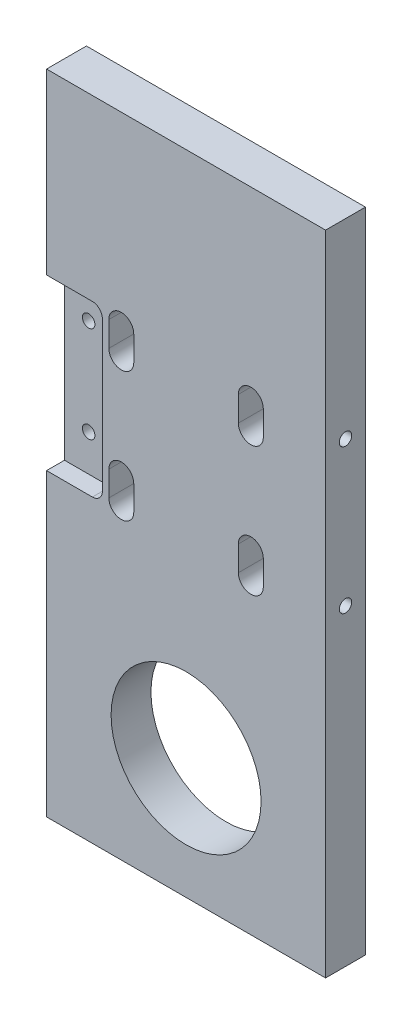
ISO-10303-21;
HEADER;
FILE_DESCRIPTION(('STEP AP214'),'2;1');
FILE_NAME('part.step','',(''),(''),'','','');
FILE_SCHEMA(('AUTOMOTIVE_DESIGN { 1 0 10303 214 1 1 1 1 }'));
ENDSEC;
DATA;
#1=APPLICATION_CONTEXT('core data for automotive mechanical design processes');
#2=APPLICATION_PROTOCOL_DEFINITION('international standard','automotive_design',2000,#1);
#3=PRODUCT_CONTEXT('',#1,'mechanical');
#4=PRODUCT('Part','Part','',(#3));
#5=PRODUCT_RELATED_PRODUCT_CATEGORY('part','',(#4));
#6=PRODUCT_DEFINITION_FORMATION('','',#4);
#7=PRODUCT_DEFINITION_CONTEXT('part definition',#1,'design');
#8=PRODUCT_DEFINITION('design','',#6,#7);
#9=PRODUCT_DEFINITION_SHAPE('','',#8);
#10=(LENGTH_UNIT() NAMED_UNIT(*) SI_UNIT(.MILLI.,.METRE.));
#11=(NAMED_UNIT(*) PLANE_ANGLE_UNIT() SI_UNIT($,.RADIAN.));
#12=(NAMED_UNIT(*) SI_UNIT($,.STERADIAN.) SOLID_ANGLE_UNIT());
#13=UNCERTAINTY_MEASURE_WITH_UNIT(LENGTH_MEASURE(1.E-05),#10,'distance_accuracy_value','');
#14=(GEOMETRIC_REPRESENTATION_CONTEXT(3) GLOBAL_UNCERTAINTY_ASSIGNED_CONTEXT((#13)) GLOBAL_UNIT_ASSIGNED_CONTEXT((#10,
#11,#12)) REPRESENTATION_CONTEXT('',''));
#15=CARTESIAN_POINT('',(0.,0.,0.));
#16=DIRECTION('',(0.,0.,1.));
#17=DIRECTION('',(1.,0.,0.));
#18=AXIS2_PLACEMENT_3D('',#15,#16,#17);
#19=CARTESIAN_POINT('',(28.,67.5,4.));
#20=DIRECTION('',(1.,0.,0.));
#21=DIRECTION('',(0.,1.,0.));
#22=AXIS2_PLACEMENT_3D('',#19,#20,#21);
#23=CYLINDRICAL_SURFACE('',#22,1.24999999999999);
#24=CARTESIAN_POINT('',(28.,67.5,4.));
#25=DIRECTION('',(1.,0.,0.));
#26=DIRECTION('',(0.,1.,0.));
#27=AXIS2_PLACEMENT_3D('',#24,#25,#26);
#28=CIRCLE('',#27,1.24999999999999);
#29=CARTESIAN_POINT('',(28.,68.75,4.));
#30=VERTEX_POINT('',#29);
#31=EDGE_CURVE('E11',#30,#30,#28,.T.);
#32=ORIENTED_EDGE('',*,*,#31,.T.);
#33=EDGE_LOOP('',(#32));
#34=FACE_BOUND('',#33,.T.);
#35=CARTESIAN_POINT('',(16.,67.5,4.));
#36=DIRECTION('',(1.,0.,0.));
#37=DIRECTION('',(0.,1.,0.));
#38=AXIS2_PLACEMENT_3D('',#35,#36,#37);
#39=CIRCLE('',#38,1.25);
#40=CARTESIAN_POINT('',(16.,68.75,4.));
#41=VERTEX_POINT('',#40);
#42=EDGE_CURVE('E26',#41,#41,#39,.T.);
#43=ORIENTED_EDGE('',*,*,#42,.F.);
#44=EDGE_LOOP('',(#43));
#45=FACE_BOUND('',#44,.T.);
#46=ADVANCED_FACE('F16',(#34,#45),#23,.F.);
#47=CARTESIAN_POINT('',(16.,67.5,4.));
#48=DIRECTION('',(1.,0.,0.));
#49=DIRECTION('',(0.,1.,0.));
#50=AXIS2_PLACEMENT_3D('',#47,#48,#49);
#51=CONICAL_SURFACE('',#50,1.25,1.02974425867666);
#52=ORIENTED_EDGE('',*,*,#42,.T.);
#53=EDGE_LOOP('',(#52));
#54=FACE_BOUND('',#53,.T.);
#55=CARTESIAN_POINT('',(15.5,67.5,4.));
#56=DIRECTION('',(1.,0.,0.));
#57=DIRECTION('',(0.,0.,1.));
#58=AXIS2_PLACEMENT_3D('',#55,#56,#57);
#59=CIRCLE('',#58,0.417860258824787);
#60=CARTESIAN_POINT('',(15.5,67.5,4.41786025882479));
#61=VERTEX_POINT('',#60);
#62=EDGE_CURVE('E266',#61,#61,#59,.T.);
#63=ORIENTED_EDGE('',*,*,#62,.F.);
#64=EDGE_LOOP('',(#63));
#65=FACE_BOUND('',#64,.T.);
#66=ADVANCED_FACE('F439',(#54,#65),#51,.F.);
#67=CARTESIAN_POINT('',(28.,38.5,4.));
#68=DIRECTION('',(1.,0.,0.));
#69=DIRECTION('',(0.,1.,0.));
#70=AXIS2_PLACEMENT_3D('',#67,#68,#69);
#71=CYLINDRICAL_SURFACE('',#70,1.24999999999999);
#72=CARTESIAN_POINT('',(28.,38.5,4.));
#73=DIRECTION('',(1.,0.,0.));
#74=DIRECTION('',(0.,1.,0.));
#75=AXIS2_PLACEMENT_3D('',#72,#73,#74);
#76=CIRCLE('',#75,1.24999999999999);
#77=CARTESIAN_POINT('',(28.,39.75,4.));
#78=VERTEX_POINT('',#77);
#79=EDGE_CURVE('E431',#78,#78,#76,.T.);
#80=ORIENTED_EDGE('',*,*,#79,.T.);
#81=EDGE_LOOP('',(#80));
#82=FACE_BOUND('',#81,.T.);
#83=CARTESIAN_POINT('',(16.,38.5,4.));
#84=DIRECTION('',(1.,0.,0.));
#85=DIRECTION('',(0.,1.,0.));
#86=AXIS2_PLACEMENT_3D('',#83,#84,#85);
#87=CIRCLE('',#86,1.24999999999999);
#88=CARTESIAN_POINT('',(16.,39.75,4.));
#89=VERTEX_POINT('',#88);
#90=EDGE_CURVE('E426',#89,#89,#87,.T.);
#91=ORIENTED_EDGE('',*,*,#90,.F.);
#92=EDGE_LOOP('',(#91));
#93=FACE_BOUND('',#92,.T.);
#94=ADVANCED_FACE('F449',(#82,#93),#71,.F.);
#95=CARTESIAN_POINT('',(16.,38.5,4.));
#96=DIRECTION('',(1.,0.,0.));
#97=DIRECTION('',(0.,1.,0.));
#98=AXIS2_PLACEMENT_3D('',#95,#96,#97);
#99=CONICAL_SURFACE('',#98,1.24999999999999,1.02974425867665);
#100=ORIENTED_EDGE('',*,*,#90,.T.);
#101=EDGE_LOOP('',(#100));
#102=FACE_BOUND('',#101,.T.);
#103=CARTESIAN_POINT('',(15.5,38.5,4.));
#104=DIRECTION('',(1.,0.,0.));
#105=DIRECTION('',(0.,0.,1.));
#106=AXIS2_PLACEMENT_3D('',#103,#104,#105);
#107=CIRCLE('',#106,0.417860258824766);
#108=CARTESIAN_POINT('',(15.5,38.5,4.41786025882477));
#109=VERTEX_POINT('',#108);
#110=EDGE_CURVE('E232',#109,#109,#107,.T.);
#111=ORIENTED_EDGE('',*,*,#110,.F.);
#112=EDGE_LOOP('',(#111));
#113=FACE_BOUND('',#112,.T.);
#114=ADVANCED_FACE('F456',(#102,#113),#99,.F.);
#115=CARTESIAN_POINT('',(-23.15,62.65,4.4));
#116=DIRECTION('',(0.,0.,1.));
#117=DIRECTION('',(1.,0.,0.));
#118=AXIS2_PLACEMENT_3D('',#115,#116,#117);
#119=CYLINDRICAL_SURFACE('',#118,1.24999999999999);
#120=CARTESIAN_POINT('',(-23.15,62.65,4.4));
#121=DIRECTION('',(0.,0.,1.));
#122=DIRECTION('',(1.,0.,0.));
#123=AXIS2_PLACEMENT_3D('',#120,#121,#122);
#124=CIRCLE('',#123,1.24999999999999);
#125=CARTESIAN_POINT('',(-21.9,62.65,4.4));
#126=VERTEX_POINT('',#125);
#127=EDGE_CURVE('E421',#126,#126,#124,.T.);
#128=ORIENTED_EDGE('',*,*,#127,.T.);
#129=EDGE_LOOP('',(#128));
#130=FACE_BOUND('',#129,.T.);
#131=CARTESIAN_POINT('',(-23.15,62.65,0.));
#132=DIRECTION('',(0.,0.,1.));
#133=DIRECTION('',(1.,0.,0.));
#134=AXIS2_PLACEMENT_3D('',#131,#132,#133);
#135=CIRCLE('',#134,1.25);
#136=CARTESIAN_POINT('',(-21.9,62.65,0.));
#137=VERTEX_POINT('',#136);
#138=EDGE_CURVE('E337',#137,#137,#135,.T.);
#139=ORIENTED_EDGE('',*,*,#138,.F.);
#140=EDGE_LOOP('',(#139));
#141=FACE_BOUND('',#140,.T.);
#142=ADVANCED_FACE('F458',(#130,#141),#119,.F.);
#143=CARTESIAN_POINT('',(-23.15,43.35,4.4));
#144=DIRECTION('',(0.,0.,1.));
#145=DIRECTION('',(1.,0.,0.));
#146=AXIS2_PLACEMENT_3D('',#143,#144,#145);
#147=CYLINDRICAL_SURFACE('',#146,1.24999999999999);
#148=CARTESIAN_POINT('',(-23.15,43.35,4.4));
#149=DIRECTION('',(0.,0.,1.));
#150=DIRECTION('',(1.,0.,0.));
#151=AXIS2_PLACEMENT_3D('',#148,#149,#150);
#152=CIRCLE('',#151,1.24999999999999);
#153=CARTESIAN_POINT('',(-21.9,43.35,4.4));
#154=VERTEX_POINT('',#153);
#155=EDGE_CURVE('E414',#154,#154,#152,.T.);
#156=ORIENTED_EDGE('',*,*,#155,.T.);
#157=EDGE_LOOP('',(#156));
#158=FACE_BOUND('',#157,.T.);
#159=CARTESIAN_POINT('',(-23.15,43.35,0.));
#160=DIRECTION('',(0.,0.,1.));
#161=DIRECTION('',(1.,0.,0.));
#162=AXIS2_PLACEMENT_3D('',#159,#160,#161);
#163=CIRCLE('',#162,1.25);
#164=CARTESIAN_POINT('',(-21.9,43.35,0.));
#165=VERTEX_POINT('',#164);
#166=EDGE_CURVE('E333',#165,#165,#163,.T.);
#167=ORIENTED_EDGE('',*,*,#166,.F.);
#168=EDGE_LOOP('',(#167));
#169=FACE_BOUND('',#168,.T.);
#170=ADVANCED_FACE('F461',(#158,#169),#147,.F.);
#171=CARTESIAN_POINT('',(0.,0.,8.));
#172=DIRECTION('',(0.,0.,-1.));
#173=DIRECTION('',(0.,-1.,0.));
#174=AXIS2_PLACEMENT_3D('',#171,#172,#173);
#175=CYLINDRICAL_SURFACE('',#174,15.05);
#176=CARTESIAN_POINT('',(0.,0.,0.));
#177=DIRECTION('',(0.,0.,1.));
#178=DIRECTION('',(1.,0.,0.));
#179=AXIS2_PLACEMENT_3D('',#176,#177,#178);
#180=CIRCLE('',#179,15.05);
#181=CARTESIAN_POINT('',(15.05,0.,0.));
#182=VERTEX_POINT('',#181);
#183=EDGE_CURVE('E357',#182,#182,#180,.T.);
#184=ORIENTED_EDGE('',*,*,#183,.F.);
#185=EDGE_LOOP('',(#184));
#186=FACE_BOUND('',#185,.T.);
#187=CARTESIAN_POINT('',(0.,0.,8.));
#188=DIRECTION('',(0.,0.,1.));
#189=DIRECTION('',(1.,0.,0.));
#190=AXIS2_PLACEMENT_3D('',#187,#188,#189);
#191=CIRCLE('',#190,15.05);
#192=CARTESIAN_POINT('',(15.05,0.,8.));
#193=VERTEX_POINT('',#192);
#194=EDGE_CURVE('E411',#193,#193,#191,.T.);
#195=ORIENTED_EDGE('',*,*,#194,.T.);
#196=EDGE_LOOP('',(#195));
#197=FACE_BOUND('',#196,.T.);
#198=ADVANCED_FACE('F465',(#186,#197),#175,.F.);
#199=CARTESIAN_POINT('',(0.,0.,8.));
#200=DIRECTION('',(0.,0.,-1.));
#201=DIRECTION('',(-1.,0.,0.));
#202=AXIS2_PLACEMENT_3D('',#199,#200,#201);
#203=PLANE('',#202);
#204=DIRECTION('',(0.,-1.,0.));
#205=VECTOR('',#204,1.);
#206=CARTESIAN_POINT('',(-28.,-24.2,8.));
#207=LINE('',#206,#205);
#208=CARTESIAN_POINT('',(-28.,105.8,8.));
#209=VERTEX_POINT('',#208);
#210=CARTESIAN_POINT('',(-28.,70.,8.));
#211=VERTEX_POINT('',#210);
#212=EDGE_CURVE('E408',#209,#211,#207,.T.);
#213=ORIENTED_EDGE('',*,*,#212,.T.);
#214=DIRECTION('',(-1.,0.,0.));
#215=VECTOR('',#214,1.);
#216=CARTESIAN_POINT('',(-16.8,70.,8.));
#217=LINE('',#216,#215);
#218=CARTESIAN_POINT('',(-18.8,70.,8.));
#219=VERTEX_POINT('',#218);
#220=EDGE_CURVE('E35',#219,#211,#217,.T.);
#221=ORIENTED_EDGE('',*,*,#220,.F.);
#222=CARTESIAN_POINT('',(-18.8,68.,8.));
#223=DIRECTION('',(0.,0.,-1.));
#224=DIRECTION('',(0.,-1.,0.));
#225=AXIS2_PLACEMENT_3D('',#222,#223,#224);
#226=CIRCLE('',#225,2.);
#227=CARTESIAN_POINT('',(-16.8,68.,8.));
#228=VERTEX_POINT('',#227);
#229=EDGE_CURVE('E404',#219,#228,#226,.T.);
#230=ORIENTED_EDGE('',*,*,#229,.T.);
#231=DIRECTION('',(0.,1.,0.));
#232=VECTOR('',#231,1.);
#233=CARTESIAN_POINT('',(-16.8,36.,8.));
#234=LINE('',#233,#232);
#235=CARTESIAN_POINT('',(-16.8,38.,8.));
#236=VERTEX_POINT('',#235);
#237=EDGE_CURVE('E218',#236,#228,#234,.T.);
#238=ORIENTED_EDGE('',*,*,#237,.F.);
#239=CARTESIAN_POINT('',(-18.8,38.,8.));
#240=DIRECTION('',(0.,0.,-1.));
#241=DIRECTION('',(0.,-1.,0.));
#242=AXIS2_PLACEMENT_3D('',#239,#240,#241);
#243=CIRCLE('',#242,2.);
#244=CARTESIAN_POINT('',(-18.8,36.,8.));
#245=VERTEX_POINT('',#244);
#246=EDGE_CURVE('E401',#236,#245,#243,.T.);
#247=ORIENTED_EDGE('',*,*,#246,.T.);
#248=DIRECTION('',(1.,0.,0.));
#249=VECTOR('',#248,1.);
#250=CARTESIAN_POINT('',(-16.8,36.,8.));
#251=LINE('',#250,#249);
#252=CARTESIAN_POINT('',(-28.,36.,8.));
#253=VERTEX_POINT('',#252);
#254=EDGE_CURVE('E206',#253,#245,#251,.T.);
#255=ORIENTED_EDGE('',*,*,#254,.F.);
#256=DIRECTION('',(0.,-1.,0.));
#257=VECTOR('',#256,1.);
#258=CARTESIAN_POINT('',(-28.,-24.2,8.));
#259=LINE('',#258,#257);
#260=CARTESIAN_POINT('',(-28.,-24.2,8.));
#261=VERTEX_POINT('',#260);
#262=EDGE_CURVE('E398',#253,#261,#259,.T.);
#263=ORIENTED_EDGE('',*,*,#262,.T.);
#264=DIRECTION('',(1.,0.,0.));
#265=VECTOR('',#264,1.);
#266=CARTESIAN_POINT('',(-28.,-24.2,8.));
#267=LINE('',#266,#265);
#268=CARTESIAN_POINT('',(28.,-24.2,8.));
#269=VERTEX_POINT('',#268);
#270=EDGE_CURVE('E395',#261,#269,#267,.T.);
#271=ORIENTED_EDGE('',*,*,#270,.T.);
#272=DIRECTION('',(0.,1.,0.));
#273=VECTOR('',#272,1.);
#274=CARTESIAN_POINT('',(28.,-24.2,8.));
#275=LINE('',#274,#273);
#276=CARTESIAN_POINT('',(28.,105.8,8.));
#277=VERTEX_POINT('',#276);
#278=EDGE_CURVE('E392',#269,#277,#275,.T.);
#279=ORIENTED_EDGE('',*,*,#278,.T.);
#280=DIRECTION('',(-1.,0.,0.));
#281=VECTOR('',#280,1.);
#282=CARTESIAN_POINT('',(-28.,105.8,8.));
#283=LINE('',#282,#281);
#284=EDGE_CURVE('E389',#277,#209,#283,.T.);
#285=ORIENTED_EDGE('',*,*,#284,.T.);
#286=EDGE_LOOP('',(#213,#221,#230,#238,#247,#255,#263,#271,#279,#285));
#287=FACE_BOUND('',#286,.T.);
#288=ORIENTED_EDGE('',*,*,#194,.F.);
#289=EDGE_LOOP('',(#288));
#290=FACE_BOUND('',#289,.T.);
#291=CARTESIAN_POINT('',(-13.,42.5,8.));
#292=DIRECTION('',(0.,0.,1.));
#293=DIRECTION('',(1.,0.,0.));
#294=AXIS2_PLACEMENT_3D('',#291,#292,#293);
#295=CIRCLE('',#294,2.5);
#296=CARTESIAN_POINT('',(-10.5,42.5,8.));
#297=VERTEX_POINT('',#296);
#298=CARTESIAN_POINT('',(-15.5,42.5,8.));
#299=VERTEX_POINT('',#298);
#300=EDGE_CURVE('E244',#297,#299,#295,.T.);
#301=ORIENTED_EDGE('',*,*,#300,.F.);
#302=DIRECTION('',(0.,1.,0.));
#303=VECTOR('',#302,1.);
#304=CARTESIAN_POINT('',(-10.5,42.5,8.));
#305=LINE('',#304,#303);
#306=CARTESIAN_POINT('',(-10.5,37.5,8.));
#307=VERTEX_POINT('',#306);
#308=EDGE_CURVE('E248',#307,#297,#305,.T.);
#309=ORIENTED_EDGE('',*,*,#308,.F.);
#310=CARTESIAN_POINT('',(-13.,37.5,8.));
#311=DIRECTION('',(0.,0.,1.));
#312=DIRECTION('',(1.,0.,0.));
#313=AXIS2_PLACEMENT_3D('',#310,#311,#312);
#314=CIRCLE('',#313,2.5);
#315=CARTESIAN_POINT('',(-15.5,37.5,8.));
#316=VERTEX_POINT('',#315);
#317=EDGE_CURVE('E253',#316,#307,#314,.T.);
#318=ORIENTED_EDGE('',*,*,#317,.F.);
#319=DIRECTION('',(0.,-1.,0.));
#320=VECTOR('',#319,1.);
#321=CARTESIAN_POINT('',(-15.5,42.5,8.));
#322=LINE('',#321,#320);
#323=EDGE_CURVE('E252',#299,#316,#322,.T.);
#324=ORIENTED_EDGE('',*,*,#323,.F.);
#325=EDGE_LOOP('',(#301,#309,#318,#324));
#326=FACE_BOUND('',#325,.T.);
#327=CARTESIAN_POINT('',(13.,42.5,8.));
#328=DIRECTION('',(0.,0.,1.));
#329=DIRECTION('',(1.,0.,0.));
#330=AXIS2_PLACEMENT_3D('',#327,#328,#329);
#331=CIRCLE('',#330,2.5);
#332=CARTESIAN_POINT('',(15.5,42.5,8.));
#333=VERTEX_POINT('',#332);
#334=CARTESIAN_POINT('',(10.5,42.5,8.));
#335=VERTEX_POINT('',#334);
#336=EDGE_CURVE('E227',#333,#335,#331,.T.);
#337=ORIENTED_EDGE('',*,*,#336,.F.);
#338=DIRECTION('',(0.,1.,0.));
#339=VECTOR('',#338,1.);
#340=CARTESIAN_POINT('',(15.5,42.5,8.));
#341=LINE('',#340,#339);
#342=CARTESIAN_POINT('',(15.5,37.5,8.));
#343=VERTEX_POINT('',#342);
#344=EDGE_CURVE('E231',#343,#333,#341,.T.);
#345=ORIENTED_EDGE('',*,*,#344,.F.);
#346=CARTESIAN_POINT('',(13.,37.5,8.));
#347=DIRECTION('',(0.,0.,1.));
#348=DIRECTION('',(1.,0.,0.));
#349=AXIS2_PLACEMENT_3D('',#346,#347,#348);
#350=CIRCLE('',#349,2.5);
#351=CARTESIAN_POINT('',(10.5,37.5,8.));
#352=VERTEX_POINT('',#351);
#353=EDGE_CURVE('E237',#352,#343,#350,.T.);
#354=ORIENTED_EDGE('',*,*,#353,.F.);
#355=DIRECTION('',(0.,-1.,0.));
#356=VECTOR('',#355,1.);
#357=CARTESIAN_POINT('',(10.5,42.5,8.));
#358=LINE('',#357,#356);
#359=EDGE_CURVE('E236',#335,#352,#358,.T.);
#360=ORIENTED_EDGE('',*,*,#359,.F.);
#361=EDGE_LOOP('',(#337,#345,#354,#360));
#362=FACE_BOUND('',#361,.T.);
#363=DIRECTION('',(0.,-1.,0.));
#364=VECTOR('',#363,1.);
#365=CARTESIAN_POINT('',(10.5,68.5,8.));
#366=LINE('',#365,#364);
#367=CARTESIAN_POINT('',(10.5,68.5,8.));
#368=VERTEX_POINT('',#367);
#369=CARTESIAN_POINT('',(10.5,63.5,8.));
#370=VERTEX_POINT('',#369);
#371=EDGE_CURVE('E261',#368,#370,#366,.T.);
#372=ORIENTED_EDGE('',*,*,#371,.F.);
#373=CARTESIAN_POINT('',(13.,68.5,8.));
#374=DIRECTION('',(0.,0.,1.));
#375=DIRECTION('',(1.,0.,0.));
#376=AXIS2_PLACEMENT_3D('',#373,#374,#375);
#377=CIRCLE('',#376,2.5);
#378=CARTESIAN_POINT('',(15.5,68.5,8.));
#379=VERTEX_POINT('',#378);
#380=EDGE_CURVE('E270',#379,#368,#377,.T.);
#381=ORIENTED_EDGE('',*,*,#380,.F.);
#382=DIRECTION('',(0.,1.,0.));
#383=VECTOR('',#382,1.);
#384=CARTESIAN_POINT('',(15.5,68.5,8.));
#385=LINE('',#384,#383);
#386=CARTESIAN_POINT('',(15.5,63.5,8.));
#387=VERTEX_POINT('',#386);
#388=EDGE_CURVE('E265',#387,#379,#385,.T.);
#389=ORIENTED_EDGE('',*,*,#388,.F.);
#390=CARTESIAN_POINT('',(13.,63.5,8.));
#391=DIRECTION('',(0.,0.,1.));
#392=DIRECTION('',(1.,0.,0.));
#393=AXIS2_PLACEMENT_3D('',#390,#391,#392);
#394=CIRCLE('',#393,2.5);
#395=EDGE_CURVE('E260',#370,#387,#394,.T.);
#396=ORIENTED_EDGE('',*,*,#395,.F.);
#397=EDGE_LOOP('',(#372,#381,#389,#396));
#398=FACE_BOUND('',#397,.T.);
#399=DIRECTION('',(0.,-1.,0.));
#400=VECTOR('',#399,1.);
#401=CARTESIAN_POINT('',(-15.5,68.5,8.));
#402=LINE('',#401,#400);
#403=CARTESIAN_POINT('',(-15.5,68.5,8.));
#404=VERTEX_POINT('',#403);
#405=CARTESIAN_POINT('',(-15.5,63.5,8.));
#406=VERTEX_POINT('',#405);
#407=EDGE_CURVE('E278',#404,#406,#402,.T.);
#408=ORIENTED_EDGE('',*,*,#407,.F.);
#409=CARTESIAN_POINT('',(-13.,68.5,8.));
#410=DIRECTION('',(0.,0.,1.));
#411=DIRECTION('',(1.,0.,0.));
#412=AXIS2_PLACEMENT_3D('',#409,#410,#411);
#413=CIRCLE('',#412,2.5);
#414=CARTESIAN_POINT('',(-10.5,68.5,8.));
#415=VERTEX_POINT('',#414);
#416=EDGE_CURVE('E286',#415,#404,#413,.T.);
#417=ORIENTED_EDGE('',*,*,#416,.F.);
#418=DIRECTION('',(0.,1.,0.));
#419=VECTOR('',#418,1.);
#420=CARTESIAN_POINT('',(-10.5,68.5,8.));
#421=LINE('',#420,#419);
#422=CARTESIAN_POINT('',(-10.5,63.5,8.));
#423=VERTEX_POINT('',#422);
#424=EDGE_CURVE('E282',#423,#415,#421,.T.);
#425=ORIENTED_EDGE('',*,*,#424,.F.);
#426=CARTESIAN_POINT('',(-13.,63.5,8.));
#427=DIRECTION('',(0.,0.,1.));
#428=DIRECTION('',(1.,0.,0.));
#429=AXIS2_PLACEMENT_3D('',#426,#427,#428);
#430=CIRCLE('',#429,2.5);
#431=EDGE_CURVE('E277',#406,#423,#430,.T.);
#432=ORIENTED_EDGE('',*,*,#431,.F.);
#433=EDGE_LOOP('',(#408,#417,#425,#432));
#434=FACE_BOUND('',#433,.T.);
#435=ADVANCED_FACE('F472',(#287,#290,#326,#362,#398,#434),#203,.F.);
#436=CARTESIAN_POINT('',(0.,0.,0.));
#437=DIRECTION('',(0.,0.,-1.));
#438=DIRECTION('',(-1.,0.,0.));
#439=AXIS2_PLACEMENT_3D('',#436,#437,#438);
#440=PLANE('',#439);
#441=DIRECTION('',(0.,-1.,0.));
#442=VECTOR('',#441,1.);
#443=CARTESIAN_POINT('',(-28.,-24.2,0.));
#444=LINE('',#443,#442);
#445=CARTESIAN_POINT('',(-28.,105.8,0.));
#446=VERTEX_POINT('',#445);
#447=CARTESIAN_POINT('',(-28.,-24.2,0.));
#448=VERTEX_POINT('',#447);
#449=EDGE_CURVE('E307',#446,#448,#444,.T.);
#450=ORIENTED_EDGE('',*,*,#449,.F.);
#451=DIRECTION('',(-1.,0.,0.));
#452=VECTOR('',#451,1.);
#453=CARTESIAN_POINT('',(-28.,105.8,0.));
#454=LINE('',#453,#452);
#455=CARTESIAN_POINT('',(28.,105.8,0.));
#456=VERTEX_POINT('',#455);
#457=EDGE_CURVE('E293',#456,#446,#454,.T.);
#458=ORIENTED_EDGE('',*,*,#457,.F.);
#459=DIRECTION('',(0.,1.,0.));
#460=VECTOR('',#459,1.);
#461=CARTESIAN_POINT('',(28.,-24.2,0.));
#462=LINE('',#461,#460);
#463=CARTESIAN_POINT('',(28.,-24.2,0.));
#464=VERTEX_POINT('',#463);
#465=EDGE_CURVE('E297',#464,#456,#462,.T.);
#466=ORIENTED_EDGE('',*,*,#465,.F.);
#467=DIRECTION('',(1.,0.,0.));
#468=VECTOR('',#467,1.);
#469=CARTESIAN_POINT('',(-28.,-24.2,0.));
#470=LINE('',#469,#468);
#471=EDGE_CURVE('E302',#448,#464,#470,.T.);
#472=ORIENTED_EDGE('',*,*,#471,.F.);
#473=EDGE_LOOP('',(#450,#458,#466,#472));
#474=FACE_BOUND('',#473,.T.);
#475=ORIENTED_EDGE('',*,*,#183,.T.);
#476=EDGE_LOOP('',(#475));
#477=FACE_BOUND('',#476,.T.);
#478=CARTESIAN_POINT('',(-13.,42.5,0.));
#479=DIRECTION('',(0.,0.,1.));
#480=DIRECTION('',(1.,0.,0.));
#481=AXIS2_PLACEMENT_3D('',#478,#479,#480);
#482=CIRCLE('',#481,2.5);
#483=CARTESIAN_POINT('',(-10.5,42.5,0.));
#484=VERTEX_POINT('',#483);
#485=CARTESIAN_POINT('',(-15.5,42.5,0.));
#486=VERTEX_POINT('',#485);
#487=EDGE_CURVE('E354',#484,#486,#482,.T.);
#488=ORIENTED_EDGE('',*,*,#487,.T.);
#489=DIRECTION('',(0.,-1.,0.));
#490=VECTOR('',#489,1.);
#491=CARTESIAN_POINT('',(-15.5,42.5,0.));
#492=LINE('',#491,#490);
#493=CARTESIAN_POINT('',(-15.5,37.5,0.));
#494=VERTEX_POINT('',#493);
#495=EDGE_CURVE('E351',#486,#494,#492,.T.);
#496=ORIENTED_EDGE('',*,*,#495,.T.);
#497=CARTESIAN_POINT('',(-13.,37.5,0.));
#498=DIRECTION('',(0.,0.,1.));
#499=DIRECTION('',(1.,0.,0.));
#500=AXIS2_PLACEMENT_3D('',#497,#498,#499);
#501=CIRCLE('',#500,2.5);
#502=CARTESIAN_POINT('',(-10.5,37.5,0.));
#503=VERTEX_POINT('',#502);
#504=EDGE_CURVE('E348',#494,#503,#501,.T.);
#505=ORIENTED_EDGE('',*,*,#504,.T.);
#506=DIRECTION('',(0.,1.,0.));
#507=VECTOR('',#506,1.);
#508=CARTESIAN_POINT('',(-10.5,42.5,0.));
#509=LINE('',#508,#507);
#510=EDGE_CURVE('E346',#503,#484,#509,.T.);
#511=ORIENTED_EDGE('',*,*,#510,.T.);
#512=EDGE_LOOP('',(#488,#496,#505,#511));
#513=FACE_BOUND('',#512,.T.);
#514=CARTESIAN_POINT('',(13.,42.5,0.));
#515=DIRECTION('',(0.,0.,1.));
#516=DIRECTION('',(1.,0.,0.));
#517=AXIS2_PLACEMENT_3D('',#514,#515,#516);
#518=CIRCLE('',#517,2.5);
#519=CARTESIAN_POINT('',(15.5,42.5,0.));
#520=VERTEX_POINT('',#519);
#521=CARTESIAN_POINT('',(10.5,42.5,0.));
#522=VERTEX_POINT('',#521);
#523=EDGE_CURVE('E343',#520,#522,#518,.T.);
#524=ORIENTED_EDGE('',*,*,#523,.T.);
#525=DIRECTION('',(0.,-1.,0.));
#526=VECTOR('',#525,1.);
#527=CARTESIAN_POINT('',(10.5,42.5,0.));
#528=LINE('',#527,#526);
#529=CARTESIAN_POINT('',(10.5,37.5,0.));
#530=VERTEX_POINT('',#529);
#531=EDGE_CURVE('E340',#522,#530,#528,.T.);
#532=ORIENTED_EDGE('',*,*,#531,.T.);
#533=CARTESIAN_POINT('',(13.,37.5,0.));
#534=DIRECTION('',(0.,0.,1.));
#535=DIRECTION('',(1.,0.,0.));
#536=AXIS2_PLACEMENT_3D('',#533,#534,#535);
#537=CIRCLE('',#536,2.5);
#538=CARTESIAN_POINT('',(15.5,37.5,0.));
#539=VERTEX_POINT('',#538);
#540=EDGE_CURVE('E336',#530,#539,#537,.T.);
#541=ORIENTED_EDGE('',*,*,#540,.T.);
#542=DIRECTION('',(0.,1.,0.));
#543=VECTOR('',#542,1.);
#544=CARTESIAN_POINT('',(15.5,42.5,0.));
#545=LINE('',#544,#543);
#546=EDGE_CURVE('E334',#539,#520,#545,.T.);
#547=ORIENTED_EDGE('',*,*,#546,.T.);
#548=EDGE_LOOP('',(#524,#532,#541,#547));
#549=FACE_BOUND('',#548,.T.);
#550=ORIENTED_EDGE('',*,*,#138,.T.);
#551=EDGE_LOOP('',(#550));
#552=FACE_BOUND('',#551,.T.);
#553=ORIENTED_EDGE('',*,*,#166,.T.);
#554=EDGE_LOOP('',(#553));
#555=FACE_BOUND('',#554,.T.);
#556=CARTESIAN_POINT('',(13.,68.5,0.));
#557=DIRECTION('',(0.,0.,1.));
#558=DIRECTION('',(1.,0.,0.));
#559=AXIS2_PLACEMENT_3D('',#556,#557,#558);
#560=CIRCLE('',#559,2.5);
#561=CARTESIAN_POINT('',(15.5,68.5,0.));
#562=VERTEX_POINT('',#561);
#563=CARTESIAN_POINT('',(10.5,68.5,0.));
#564=VERTEX_POINT('',#563);
#565=EDGE_CURVE('E330',#562,#564,#560,.T.);
#566=ORIENTED_EDGE('',*,*,#565,.T.);
#567=DIRECTION('',(0.,-1.,0.));
#568=VECTOR('',#567,1.);
#569=CARTESIAN_POINT('',(10.5,68.5,0.));
#570=LINE('',#569,#568);
#571=CARTESIAN_POINT('',(10.5,63.5,0.));
#572=VERTEX_POINT('',#571);
#573=EDGE_CURVE('E327',#564,#572,#570,.T.);
#574=ORIENTED_EDGE('',*,*,#573,.T.);
#575=CARTESIAN_POINT('',(13.,63.5,0.));
#576=DIRECTION('',(0.,0.,1.));
#577=DIRECTION('',(1.,0.,0.));
#578=AXIS2_PLACEMENT_3D('',#575,#576,#577);
#579=CIRCLE('',#578,2.5);
#580=CARTESIAN_POINT('',(15.5,63.5,0.));
#581=VERTEX_POINT('',#580);
#582=EDGE_CURVE('E324',#572,#581,#579,.T.);
#583=ORIENTED_EDGE('',*,*,#582,.T.);
#584=DIRECTION('',(0.,1.,0.));
#585=VECTOR('',#584,1.);
#586=CARTESIAN_POINT('',(15.5,68.5,0.));
#587=LINE('',#586,#585);
#588=EDGE_CURVE('E322',#581,#562,#587,.T.);
#589=ORIENTED_EDGE('',*,*,#588,.T.);
#590=EDGE_LOOP('',(#566,#574,#583,#589));
#591=FACE_BOUND('',#590,.T.);
#592=CARTESIAN_POINT('',(-13.,68.5,0.));
#593=DIRECTION('',(0.,0.,1.));
#594=DIRECTION('',(1.,0.,0.));
#595=AXIS2_PLACEMENT_3D('',#592,#593,#594);
#596=CIRCLE('',#595,2.5);
#597=CARTESIAN_POINT('',(-10.5,68.5,0.));
#598=VERTEX_POINT('',#597);
#599=CARTESIAN_POINT('',(-15.5,68.5,0.));
#600=VERTEX_POINT('',#599);
#601=EDGE_CURVE('E319',#598,#600,#596,.T.);
#602=ORIENTED_EDGE('',*,*,#601,.T.);
#603=DIRECTION('',(0.,-1.,0.));
#604=VECTOR('',#603,1.);
#605=CARTESIAN_POINT('',(-15.5,68.5,0.));
#606=LINE('',#605,#604);
#607=CARTESIAN_POINT('',(-15.5,63.5,0.));
#608=VERTEX_POINT('',#607);
#609=EDGE_CURVE('E316',#600,#608,#606,.T.);
#610=ORIENTED_EDGE('',*,*,#609,.T.);
#611=CARTESIAN_POINT('',(-13.,63.5,0.));
#612=DIRECTION('',(0.,0.,1.));
#613=DIRECTION('',(1.,0.,0.));
#614=AXIS2_PLACEMENT_3D('',#611,#612,#613);
#615=CIRCLE('',#614,2.5);
#616=CARTESIAN_POINT('',(-10.5,63.5,0.));
#617=VERTEX_POINT('',#616);
#618=EDGE_CURVE('E313',#608,#617,#615,.T.);
#619=ORIENTED_EDGE('',*,*,#618,.T.);
#620=DIRECTION('',(0.,1.,0.));
#621=VECTOR('',#620,1.);
#622=CARTESIAN_POINT('',(-10.5,68.5,0.));
#623=LINE('',#622,#621);
#624=EDGE_CURVE('E310',#617,#598,#623,.T.);
#625=ORIENTED_EDGE('',*,*,#624,.T.);
#626=EDGE_LOOP('',(#602,#610,#619,#625));
#627=FACE_BOUND('',#626,.T.);
#628=ADVANCED_FACE('F545',(#474,#477,#513,#549,#552,#555,#591,#627),#440,.T.);
#629=CARTESIAN_POINT('',(-28.,-24.2,8.));
#630=DIRECTION('',(1.,0.,0.));
#631=DIRECTION('',(0.,0.,-1.));
#632=AXIS2_PLACEMENT_3D('',#629,#630,#631);
#633=PLANE('',#632);
#634=DIRECTION('',(0.,-1.,0.));
#635=VECTOR('',#634,1.);
#636=CARTESIAN_POINT('',(-28.,36.,4.4));
#637=LINE('',#636,#635);
#638=CARTESIAN_POINT('',(-28.,70.,4.4));
#639=VERTEX_POINT('',#638);
#640=CARTESIAN_POINT('',(-28.,36.,4.4));
#641=VERTEX_POINT('',#640);
#642=EDGE_CURVE('E197',#639,#641,#637,.T.);
#643=ORIENTED_EDGE('',*,*,#642,.F.);
#644=DIRECTION('',(0.,0.,1.));
#645=VECTOR('',#644,1.);
#646=CARTESIAN_POINT('',(-28.,70.,4.4));
#647=LINE('',#646,#645);
#648=EDGE_CURVE('E306',#639,#211,#647,.T.);
#649=ORIENTED_EDGE('',*,*,#648,.T.);
#650=ORIENTED_EDGE('',*,*,#212,.F.);
#651=DIRECTION('',(0.,0.,-1.));
#652=VECTOR('',#651,1.);
#653=CARTESIAN_POINT('',(-28.,105.8,8.));
#654=LINE('',#653,#652);
#655=EDGE_CURVE('E303',#209,#446,#654,.T.);
#656=ORIENTED_EDGE('',*,*,#655,.T.);
#657=ORIENTED_EDGE('',*,*,#449,.T.);
#658=DIRECTION('',(0.,0.,-1.));
#659=VECTOR('',#658,1.);
#660=CARTESIAN_POINT('',(-28.,-24.2,8.));
#661=LINE('',#660,#659);
#662=EDGE_CURVE('E299',#261,#448,#661,.T.);
#663=ORIENTED_EDGE('',*,*,#662,.F.);
#664=ORIENTED_EDGE('',*,*,#262,.F.);
#665=DIRECTION('',(0.,0.,1.));
#666=VECTOR('',#665,1.);
#667=CARTESIAN_POINT('',(-28.,36.,4.4));
#668=LINE('',#667,#666);
#669=EDGE_CURVE('E201',#641,#253,#668,.T.);
#670=ORIENTED_EDGE('',*,*,#669,.F.);
#671=EDGE_LOOP('',(#643,#649,#650,#656,#657,#663,#664,#670));
#672=FACE_BOUND('',#671,.T.);
#673=ADVANCED_FACE('F527',(#672),#633,.F.);
#674=CARTESIAN_POINT('',(-28.,-24.2,8.));
#675=DIRECTION('',(0.,1.,0.));
#676=DIRECTION('',(-1.,0.,0.));
#677=AXIS2_PLACEMENT_3D('',#674,#675,#676);
#678=PLANE('',#677);
#679=ORIENTED_EDGE('',*,*,#471,.T.);
#680=DIRECTION('',(0.,0.,-1.));
#681=VECTOR('',#680,1.);
#682=CARTESIAN_POINT('',(28.,-24.2,8.));
#683=LINE('',#682,#681);
#684=EDGE_CURVE('E294',#269,#464,#683,.T.);
#685=ORIENTED_EDGE('',*,*,#684,.F.);
#686=ORIENTED_EDGE('',*,*,#270,.F.);
#687=ORIENTED_EDGE('',*,*,#662,.T.);
#688=EDGE_LOOP('',(#679,#685,#686,#687));
#689=FACE_BOUND('',#688,.T.);
#690=ADVANCED_FACE('F541',(#689),#678,.F.);
#691=CARTESIAN_POINT('',(28.,-24.2,8.));
#692=DIRECTION('',(-1.,0.,0.));
#693=DIRECTION('',(0.,-1.,0.));
#694=AXIS2_PLACEMENT_3D('',#691,#692,#693);
#695=PLANE('',#694);
#696=ORIENTED_EDGE('',*,*,#465,.T.);
#697=DIRECTION('',(0.,0.,-1.));
#698=VECTOR('',#697,1.);
#699=CARTESIAN_POINT('',(28.,105.8,8.));
#700=LINE('',#699,#698);
#701=EDGE_CURVE('E290',#277,#456,#700,.T.);
#702=ORIENTED_EDGE('',*,*,#701,.F.);
#703=ORIENTED_EDGE('',*,*,#278,.F.);
#704=ORIENTED_EDGE('',*,*,#684,.T.);
#705=EDGE_LOOP('',(#696,#702,#703,#704));
#706=FACE_BOUND('',#705,.T.);
#707=ORIENTED_EDGE('',*,*,#31,.F.);
#708=EDGE_LOOP('',(#707));
#709=FACE_BOUND('',#708,.T.);
#710=ORIENTED_EDGE('',*,*,#79,.F.);
#711=EDGE_LOOP('',(#710));
#712=FACE_BOUND('',#711,.T.);
#713=ADVANCED_FACE('F543',(#706,#709,#712),#695,.F.);
#714=CARTESIAN_POINT('',(-28.,105.8,8.));
#715=DIRECTION('',(0.,-1.,0.));
#716=DIRECTION('',(0.,0.,-1.));
#717=AXIS2_PLACEMENT_3D('',#714,#715,#716);
#718=PLANE('',#717);
#719=ORIENTED_EDGE('',*,*,#457,.T.);
#720=ORIENTED_EDGE('',*,*,#655,.F.);
#721=ORIENTED_EDGE('',*,*,#284,.F.);
#722=ORIENTED_EDGE('',*,*,#701,.T.);
#723=EDGE_LOOP('',(#719,#720,#721,#722));
#724=FACE_BOUND('',#723,.T.);
#725=ADVANCED_FACE('F478',(#724),#718,.F.);
#726=CARTESIAN_POINT('',(-13.,68.5,0.));
#727=DIRECTION('',(0.,0.,1.));
#728=DIRECTION('',(1.,0.,0.));
#729=AXIS2_PLACEMENT_3D('',#726,#727,#728);
#730=CYLINDRICAL_SURFACE('',#729,2.5);
#731=ORIENTED_EDGE('',*,*,#416,.T.);
#732=DIRECTION('',(0.,0.,1.));
#733=VECTOR('',#732,1.);
#734=CARTESIAN_POINT('',(-15.5,68.5,0.));
#735=LINE('',#734,#733);
#736=EDGE_CURVE('E287',#600,#404,#735,.T.);
#737=ORIENTED_EDGE('',*,*,#736,.F.);
#738=ORIENTED_EDGE('',*,*,#601,.F.);
#739=DIRECTION('',(0.,0.,1.));
#740=VECTOR('',#739,1.);
#741=CARTESIAN_POINT('',(-10.5,68.5,0.));
#742=LINE('',#741,#740);
#743=EDGE_CURVE('E283',#598,#415,#742,.T.);
#744=ORIENTED_EDGE('',*,*,#743,.T.);
#745=EDGE_LOOP('',(#731,#737,#738,#744));
#746=FACE_BOUND('',#745,.T.);
#747=ADVANCED_FACE('F474',(#746),#730,.F.);
#748=CARTESIAN_POINT('',(-10.5,68.5,0.));
#749=DIRECTION('',(1.,0.,0.));
#750=DIRECTION('',(0.,1.,0.));
#751=AXIS2_PLACEMENT_3D('',#748,#749,#750);
#752=PLANE('',#751);
#753=ORIENTED_EDGE('',*,*,#424,.T.);
#754=ORIENTED_EDGE('',*,*,#743,.F.);
#755=ORIENTED_EDGE('',*,*,#624,.F.);
#756=DIRECTION('',(0.,0.,1.));
#757=VECTOR('',#756,1.);
#758=CARTESIAN_POINT('',(-10.5,63.5,0.));
#759=LINE('',#758,#757);
#760=EDGE_CURVE('E279',#617,#423,#759,.T.);
#761=ORIENTED_EDGE('',*,*,#760,.T.);
#762=EDGE_LOOP('',(#753,#754,#755,#761));
#763=FACE_BOUND('',#762,.T.);
#764=ADVANCED_FACE('F477',(#763),#752,.F.);
#765=CARTESIAN_POINT('',(-13.,63.5,0.));
#766=DIRECTION('',(0.,0.,1.));
#767=DIRECTION('',(1.,0.,0.));
#768=AXIS2_PLACEMENT_3D('',#765,#766,#767);
#769=CYLINDRICAL_SURFACE('',#768,2.5);
#770=ORIENTED_EDGE('',*,*,#431,.T.);
#771=ORIENTED_EDGE('',*,*,#760,.F.);
#772=ORIENTED_EDGE('',*,*,#618,.F.);
#773=DIRECTION('',(0.,0.,1.));
#774=VECTOR('',#773,1.);
#775=CARTESIAN_POINT('',(-15.5,63.5,0.));
#776=LINE('',#775,#774);
#777=EDGE_CURVE('E274',#608,#406,#776,.T.);
#778=ORIENTED_EDGE('',*,*,#777,.T.);
#779=EDGE_LOOP('',(#770,#771,#772,#778));
#780=FACE_BOUND('',#779,.T.);
#781=ADVANCED_FACE('F497',(#780),#769,.F.);
#782=CARTESIAN_POINT('',(-15.5,68.5,0.));
#783=DIRECTION('',(-1.,0.,0.));
#784=DIRECTION('',(0.,0.,1.));
#785=AXIS2_PLACEMENT_3D('',#782,#783,#784);
#786=PLANE('',#785);
#787=ORIENTED_EDGE('',*,*,#407,.T.);
#788=ORIENTED_EDGE('',*,*,#777,.F.);
#789=ORIENTED_EDGE('',*,*,#609,.F.);
#790=ORIENTED_EDGE('',*,*,#736,.T.);
#791=EDGE_LOOP('',(#787,#788,#789,#790));
#792=FACE_BOUND('',#791,.T.);
#793=ADVANCED_FACE('F490',(#792),#786,.F.);
#794=CARTESIAN_POINT('',(13.,68.5,0.));
#795=DIRECTION('',(0.,0.,1.));
#796=DIRECTION('',(1.,0.,0.));
#797=AXIS2_PLACEMENT_3D('',#794,#795,#796);
#798=CYLINDRICAL_SURFACE('',#797,2.5);
#799=ORIENTED_EDGE('',*,*,#380,.T.);
#800=DIRECTION('',(0.,0.,1.));
#801=VECTOR('',#800,1.);
#802=CARTESIAN_POINT('',(10.5,68.5,0.));
#803=LINE('',#802,#801);
#804=EDGE_CURVE('E271',#564,#368,#803,.T.);
#805=ORIENTED_EDGE('',*,*,#804,.F.);
#806=ORIENTED_EDGE('',*,*,#565,.F.);
#807=DIRECTION('',(0.,0.,1.));
#808=VECTOR('',#807,1.);
#809=CARTESIAN_POINT('',(15.5,68.5,0.));
#810=LINE('',#809,#808);
#811=EDGE_CURVE('E267',#562,#379,#810,.T.);
#812=ORIENTED_EDGE('',*,*,#811,.T.);
#813=EDGE_LOOP('',(#799,#805,#806,#812));
#814=FACE_BOUND('',#813,.T.);
#815=ADVANCED_FACE('F486',(#814),#798,.F.);
#816=CARTESIAN_POINT('',(15.5,68.5,0.));
#817=DIRECTION('',(1.,0.,0.));
#818=DIRECTION('',(0.,1.,0.));
#819=AXIS2_PLACEMENT_3D('',#816,#817,#818);
#820=PLANE('',#819);
#821=ORIENTED_EDGE('',*,*,#388,.T.);
#822=ORIENTED_EDGE('',*,*,#811,.F.);
#823=ORIENTED_EDGE('',*,*,#588,.F.);
#824=DIRECTION('',(0.,0.,1.));
#825=VECTOR('',#824,1.);
#826=CARTESIAN_POINT('',(15.5,63.5,0.));
#827=LINE('',#826,#825);
#828=EDGE_CURVE('E262',#581,#387,#827,.T.);
#829=ORIENTED_EDGE('',*,*,#828,.T.);
#830=EDGE_LOOP('',(#821,#822,#823,#829));
#831=FACE_BOUND('',#830,.T.);
#832=ORIENTED_EDGE('',*,*,#62,.T.);
#833=EDGE_LOOP('',(#832));
#834=FACE_BOUND('',#833,.T.);
#835=ADVANCED_FACE('F489',(#831,#834),#820,.F.);
#836=CARTESIAN_POINT('',(13.,63.5,0.));
#837=DIRECTION('',(0.,0.,1.));
#838=DIRECTION('',(1.,0.,0.));
#839=AXIS2_PLACEMENT_3D('',#836,#837,#838);
#840=CYLINDRICAL_SURFACE('',#839,2.5);
#841=ORIENTED_EDGE('',*,*,#395,.T.);
#842=ORIENTED_EDGE('',*,*,#828,.F.);
#843=ORIENTED_EDGE('',*,*,#582,.F.);
#844=DIRECTION('',(0.,0.,1.));
#845=VECTOR('',#844,1.);
#846=CARTESIAN_POINT('',(10.5,63.5,0.));
#847=LINE('',#846,#845);
#848=EDGE_CURVE('E257',#572,#370,#847,.T.);
#849=ORIENTED_EDGE('',*,*,#848,.T.);
#850=EDGE_LOOP('',(#841,#842,#843,#849));
#851=FACE_BOUND('',#850,.T.);
#852=ADVANCED_FACE('F492',(#851),#840,.F.);
#853=CARTESIAN_POINT('',(10.5,68.5,0.));
#854=DIRECTION('',(-1.,0.,0.));
#855=DIRECTION('',(0.,0.,1.));
#856=AXIS2_PLACEMENT_3D('',#853,#854,#855);
#857=PLANE('',#856);
#858=ORIENTED_EDGE('',*,*,#371,.T.);
#859=ORIENTED_EDGE('',*,*,#848,.F.);
#860=ORIENTED_EDGE('',*,*,#573,.F.);
#861=ORIENTED_EDGE('',*,*,#804,.T.);
#862=EDGE_LOOP('',(#858,#859,#860,#861));
#863=FACE_BOUND('',#862,.T.);
#864=ADVANCED_FACE('F495',(#863),#857,.F.);
#865=CARTESIAN_POINT('',(-15.5,42.5,0.));
#866=DIRECTION('',(-1.,0.,0.));
#867=DIRECTION('',(0.,0.,1.));
#868=AXIS2_PLACEMENT_3D('',#865,#866,#867);
#869=PLANE('',#868);
#870=ORIENTED_EDGE('',*,*,#323,.T.);
#871=DIRECTION('',(0.,0.,1.));
#872=VECTOR('',#871,1.);
#873=CARTESIAN_POINT('',(-15.5,37.5,0.));
#874=LINE('',#873,#872);
#875=EDGE_CURVE('E254',#494,#316,#874,.T.);
#876=ORIENTED_EDGE('',*,*,#875,.F.);
#877=ORIENTED_EDGE('',*,*,#495,.F.);
#878=DIRECTION('',(0.,0.,1.));
#879=VECTOR('',#878,1.);
#880=CARTESIAN_POINT('',(-15.5,42.5,0.));
#881=LINE('',#880,#879);
#882=EDGE_CURVE('E249',#486,#299,#881,.T.);
#883=ORIENTED_EDGE('',*,*,#882,.T.);
#884=EDGE_LOOP('',(#870,#876,#877,#883));
#885=FACE_BOUND('',#884,.T.);
#886=ADVANCED_FACE('F513',(#885),#869,.F.);
#887=CARTESIAN_POINT('',(-13.,37.5,0.));
#888=DIRECTION('',(0.,0.,1.));
#889=DIRECTION('',(1.,0.,0.));
#890=AXIS2_PLACEMENT_3D('',#887,#888,#889);
#891=CYLINDRICAL_SURFACE('',#890,2.5);
#892=ORIENTED_EDGE('',*,*,#317,.T.);
#893=DIRECTION('',(0.,0.,1.));
#894=VECTOR('',#893,1.);
#895=CARTESIAN_POINT('',(-10.5,37.5,0.));
#896=LINE('',#895,#894);
#897=EDGE_CURVE('E245',#503,#307,#896,.T.);
#898=ORIENTED_EDGE('',*,*,#897,.F.);
#899=ORIENTED_EDGE('',*,*,#504,.F.);
#900=ORIENTED_EDGE('',*,*,#875,.T.);
#901=EDGE_LOOP('',(#892,#898,#899,#900));
#902=FACE_BOUND('',#901,.T.);
#903=ADVANCED_FACE('F511',(#902),#891,.F.);
#904=CARTESIAN_POINT('',(-10.5,42.5,0.));
#905=DIRECTION('',(1.,0.,0.));
#906=DIRECTION('',(0.,1.,0.));
#907=AXIS2_PLACEMENT_3D('',#904,#905,#906);
#908=PLANE('',#907);
#909=ORIENTED_EDGE('',*,*,#308,.T.);
#910=DIRECTION('',(0.,0.,1.));
#911=VECTOR('',#910,1.);
#912=CARTESIAN_POINT('',(-10.5,42.5,0.));
#913=LINE('',#912,#911);
#914=EDGE_CURVE('E241',#484,#297,#913,.T.);
#915=ORIENTED_EDGE('',*,*,#914,.F.);
#916=ORIENTED_EDGE('',*,*,#510,.F.);
#917=ORIENTED_EDGE('',*,*,#897,.T.);
#918=EDGE_LOOP('',(#909,#915,#916,#917));
#919=FACE_BOUND('',#918,.T.);
#920=ADVANCED_FACE('F509',(#919),#908,.F.);
#921=CARTESIAN_POINT('',(-13.,42.5,0.));
#922=DIRECTION('',(0.,0.,1.));
#923=DIRECTION('',(1.,0.,0.));
#924=AXIS2_PLACEMENT_3D('',#921,#922,#923);
#925=CYLINDRICAL_SURFACE('',#924,2.5);
#926=ORIENTED_EDGE('',*,*,#300,.T.);
#927=ORIENTED_EDGE('',*,*,#882,.F.);
#928=ORIENTED_EDGE('',*,*,#487,.F.);
#929=ORIENTED_EDGE('',*,*,#914,.T.);
#930=EDGE_LOOP('',(#926,#927,#928,#929));
#931=FACE_BOUND('',#930,.T.);
#932=ADVANCED_FACE('F506',(#931),#925,.F.);
#933=CARTESIAN_POINT('',(10.5,42.5,0.));
#934=DIRECTION('',(-1.,0.,0.));
#935=DIRECTION('',(0.,0.,1.));
#936=AXIS2_PLACEMENT_3D('',#933,#934,#935);
#937=PLANE('',#936);
#938=ORIENTED_EDGE('',*,*,#359,.T.);
#939=DIRECTION('',(0.,0.,1.));
#940=VECTOR('',#939,1.);
#941=CARTESIAN_POINT('',(10.5,37.5,0.));
#942=LINE('',#941,#940);
#943=EDGE_CURVE('E238',#530,#352,#942,.T.);
#944=ORIENTED_EDGE('',*,*,#943,.F.);
#945=ORIENTED_EDGE('',*,*,#531,.F.);
#946=DIRECTION('',(0.,0.,1.));
#947=VECTOR('',#946,1.);
#948=CARTESIAN_POINT('',(10.5,42.5,0.));
#949=LINE('',#948,#947);
#950=EDGE_CURVE('E233',#522,#335,#949,.T.);
#951=ORIENTED_EDGE('',*,*,#950,.T.);
#952=EDGE_LOOP('',(#938,#944,#945,#951));
#953=FACE_BOUND('',#952,.T.);
#954=ADVANCED_FACE('F484',(#953),#937,.F.);
#955=CARTESIAN_POINT('',(13.,37.5,0.));
#956=DIRECTION('',(0.,0.,1.));
#957=DIRECTION('',(1.,0.,0.));
#958=AXIS2_PLACEMENT_3D('',#955,#956,#957);
#959=CYLINDRICAL_SURFACE('',#958,2.5);
#960=ORIENTED_EDGE('',*,*,#353,.T.);
#961=DIRECTION('',(0.,0.,1.));
#962=VECTOR('',#961,1.);
#963=CARTESIAN_POINT('',(15.5,37.5,0.));
#964=LINE('',#963,#962);
#965=EDGE_CURVE('E228',#539,#343,#964,.T.);
#966=ORIENTED_EDGE('',*,*,#965,.F.);
#967=ORIENTED_EDGE('',*,*,#540,.F.);
#968=ORIENTED_EDGE('',*,*,#943,.T.);
#969=EDGE_LOOP('',(#960,#966,#967,#968));
#970=FACE_BOUND('',#969,.T.);
#971=ADVANCED_FACE('F480',(#970),#959,.F.);
#972=CARTESIAN_POINT('',(15.5,42.5,0.));
#973=DIRECTION('',(1.,0.,0.));
#974=DIRECTION('',(0.,1.,0.));
#975=AXIS2_PLACEMENT_3D('',#972,#973,#974);
#976=PLANE('',#975);
#977=ORIENTED_EDGE('',*,*,#344,.T.);
#978=DIRECTION('',(0.,0.,1.));
#979=VECTOR('',#978,1.);
#980=CARTESIAN_POINT('',(15.5,42.5,0.));
#981=LINE('',#980,#979);
#982=EDGE_CURVE('E222',#520,#333,#981,.T.);
#983=ORIENTED_EDGE('',*,*,#982,.F.);
#984=ORIENTED_EDGE('',*,*,#546,.F.);
#985=ORIENTED_EDGE('',*,*,#965,.T.);
#986=EDGE_LOOP('',(#977,#983,#984,#985));
#987=FACE_BOUND('',#986,.T.);
#988=ORIENTED_EDGE('',*,*,#110,.T.);
#989=EDGE_LOOP('',(#988));
#990=FACE_BOUND('',#989,.T.);
#991=ADVANCED_FACE('F483',(#987,#990),#976,.F.);
#992=CARTESIAN_POINT('',(13.,42.5,0.));
#993=DIRECTION('',(0.,0.,1.));
#994=DIRECTION('',(1.,0.,0.));
#995=AXIS2_PLACEMENT_3D('',#992,#993,#994);
#996=CYLINDRICAL_SURFACE('',#995,2.5);
#997=ORIENTED_EDGE('',*,*,#336,.T.);
#998=ORIENTED_EDGE('',*,*,#950,.F.);
#999=ORIENTED_EDGE('',*,*,#523,.F.);
#1000=ORIENTED_EDGE('',*,*,#982,.T.);
#1001=EDGE_LOOP('',(#997,#998,#999,#1000));
#1002=FACE_BOUND('',#1001,.T.);
#1003=ADVANCED_FACE('F501',(#1002),#996,.F.);
#1004=CARTESIAN_POINT('',(-16.8,70.,4.4));
#1005=DIRECTION('',(0.,1.,0.));
#1006=DIRECTION('',(0.,0.,1.));
#1007=AXIS2_PLACEMENT_3D('',#1004,#1005,#1006);
#1008=PLANE('',#1007);
#1009=DIRECTION('',(-1.,0.,0.));
#1010=VECTOR('',#1009,1.);
#1011=CARTESIAN_POINT('',(-16.8,70.,4.4));
#1012=LINE('',#1011,#1010);
#1013=CARTESIAN_POINT('',(-18.8,70.,4.4));
#1014=VERTEX_POINT('',#1013);
#1015=EDGE_CURVE('E223',#1014,#639,#1012,.T.);
#1016=ORIENTED_EDGE('',*,*,#1015,.F.);
#1017=DIRECTION('',(0.,0.,1.));
#1018=VECTOR('',#1017,1.);
#1019=CARTESIAN_POINT('',(-18.8,70.,8.));
#1020=LINE('',#1019,#1018);
#1021=EDGE_CURVE('E220',#1014,#219,#1020,.T.);
#1022=ORIENTED_EDGE('',*,*,#1021,.T.);
#1023=ORIENTED_EDGE('',*,*,#220,.T.);
#1024=ORIENTED_EDGE('',*,*,#648,.F.);
#1025=EDGE_LOOP('',(#1016,#1022,#1023,#1024));
#1026=FACE_BOUND('',#1025,.T.);
#1027=ADVANCED_FACE('F504',(#1026),#1008,.F.);
#1028=CARTESIAN_POINT('',(-16.8,36.,4.4));
#1029=DIRECTION('',(1.,0.,0.));
#1030=DIRECTION('',(0.,0.,-1.));
#1031=AXIS2_PLACEMENT_3D('',#1028,#1029,#1030);
#1032=PLANE('',#1031);
#1033=DIRECTION('',(0.,1.,0.));
#1034=VECTOR('',#1033,1.);
#1035=CARTESIAN_POINT('',(-16.8,36.,4.4));
#1036=LINE('',#1035,#1034);
#1037=CARTESIAN_POINT('',(-16.8,38.,4.4));
#1038=VERTEX_POINT('',#1037);
#1039=CARTESIAN_POINT('',(-16.8,68.,4.4));
#1040=VERTEX_POINT('',#1039);
#1041=EDGE_CURVE('E186',#1038,#1040,#1036,.T.);
#1042=ORIENTED_EDGE('',*,*,#1041,.F.);
#1043=DIRECTION('',(0.,0.,1.));
#1044=VECTOR('',#1043,1.);
#1045=CARTESIAN_POINT('',(-16.8,38.,8.));
#1046=LINE('',#1045,#1044);
#1047=EDGE_CURVE('E213',#1038,#236,#1046,.T.);
#1048=ORIENTED_EDGE('',*,*,#1047,.T.);
#1049=ORIENTED_EDGE('',*,*,#237,.T.);
#1050=DIRECTION('',(0.,0.,-1.));
#1051=VECTOR('',#1050,1.);
#1052=CARTESIAN_POINT('',(-16.8,68.,4.4));
#1053=LINE('',#1052,#1051);
#1054=EDGE_CURVE('E216',#228,#1040,#1053,.T.);
#1055=ORIENTED_EDGE('',*,*,#1054,.T.);
#1056=EDGE_LOOP('',(#1042,#1048,#1049,#1055));
#1057=FACE_BOUND('',#1056,.T.);
#1058=ADVANCED_FACE('F535',(#1057),#1032,.F.);
#1059=CARTESIAN_POINT('',(-16.8,36.,4.4));
#1060=DIRECTION('',(0.,-1.,0.));
#1061=DIRECTION('',(0.,0.,-1.));
#1062=AXIS2_PLACEMENT_3D('',#1059,#1060,#1061);
#1063=PLANE('',#1062);
#1064=ORIENTED_EDGE('',*,*,#254,.T.);
#1065=DIRECTION('',(0.,0.,-1.));
#1066=VECTOR('',#1065,1.);
#1067=CARTESIAN_POINT('',(-18.8,36.,4.4));
#1068=LINE('',#1067,#1066);
#1069=CARTESIAN_POINT('',(-18.8,36.,4.4));
#1070=VERTEX_POINT('',#1069);
#1071=EDGE_CURVE('E204',#245,#1070,#1068,.T.);
#1072=ORIENTED_EDGE('',*,*,#1071,.T.);
#1073=DIRECTION('',(1.,0.,0.));
#1074=VECTOR('',#1073,1.);
#1075=CARTESIAN_POINT('',(-16.8,36.,4.4));
#1076=LINE('',#1075,#1074);
#1077=EDGE_CURVE('E190',#641,#1070,#1076,.T.);
#1078=ORIENTED_EDGE('',*,*,#1077,.F.);
#1079=ORIENTED_EDGE('',*,*,#669,.T.);
#1080=EDGE_LOOP('',(#1064,#1072,#1078,#1079));
#1081=FACE_BOUND('',#1080,.T.);
#1082=ADVANCED_FACE('F205',(#1081),#1063,.F.);
#1083=CARTESIAN_POINT('',(0.,0.,4.4));
#1084=DIRECTION('',(0.,0.,1.));
#1085=DIRECTION('',(1.,0.,0.));
#1086=AXIS2_PLACEMENT_3D('',#1083,#1084,#1085);
#1087=PLANE('',#1086);
#1088=ORIENTED_EDGE('',*,*,#1077,.T.);
#1089=CARTESIAN_POINT('',(-18.8,38.,4.4));
#1090=DIRECTION('',(0.,0.,1.));
#1091=DIRECTION('',(1.,0.,0.));
#1092=AXIS2_PLACEMENT_3D('',#1089,#1090,#1091);
#1093=CIRCLE('',#1092,2.);
#1094=EDGE_CURVE('E195',#1070,#1038,#1093,.T.);
#1095=ORIENTED_EDGE('',*,*,#1094,.T.);
#1096=ORIENTED_EDGE('',*,*,#1041,.T.);
#1097=CARTESIAN_POINT('',(-18.8,68.,4.4));
#1098=DIRECTION('',(0.,0.,1.));
#1099=DIRECTION('',(1.,0.,0.));
#1100=AXIS2_PLACEMENT_3D('',#1097,#1098,#1099);
#1101=CIRCLE('',#1100,2.);
#1102=EDGE_CURVE('E20',#1040,#1014,#1101,.T.);
#1103=ORIENTED_EDGE('',*,*,#1102,.T.);
#1104=ORIENTED_EDGE('',*,*,#1015,.T.);
#1105=ORIENTED_EDGE('',*,*,#642,.T.);
#1106=EDGE_LOOP('',(#1088,#1095,#1096,#1103,#1104,#1105));
#1107=FACE_BOUND('',#1106,.T.);
#1108=ORIENTED_EDGE('',*,*,#127,.F.);
#1109=EDGE_LOOP('',(#1108));
#1110=FACE_BOUND('',#1109,.T.);
#1111=ORIENTED_EDGE('',*,*,#155,.F.);
#1112=EDGE_LOOP('',(#1111));
#1113=FACE_BOUND('',#1112,.T.);
#1114=ADVANCED_FACE('F192',(#1107,#1110,#1113),#1087,.T.);
#1115=CARTESIAN_POINT('',(-18.8,38.,4.4));
#1116=DIRECTION('',(0.,0.,-1.));
#1117=DIRECTION('',(0.,-1.,0.));
#1118=AXIS2_PLACEMENT_3D('',#1115,#1116,#1117);
#1119=CYLINDRICAL_SURFACE('',#1118,2.);
#1120=ORIENTED_EDGE('',*,*,#1094,.F.);
#1121=ORIENTED_EDGE('',*,*,#1071,.F.);
#1122=ORIENTED_EDGE('',*,*,#246,.F.);
#1123=ORIENTED_EDGE('',*,*,#1047,.F.);
#1124=EDGE_LOOP('',(#1120,#1121,#1122,#1123));
#1125=FACE_BOUND('',#1124,.T.);
#1126=ADVANCED_FACE('F18',(#1125),#1119,.F.);
#1127=CARTESIAN_POINT('',(-18.8,68.,4.4));
#1128=DIRECTION('',(0.,0.,-1.));
#1129=DIRECTION('',(0.,-1.,0.));
#1130=AXIS2_PLACEMENT_3D('',#1127,#1128,#1129);
#1131=CYLINDRICAL_SURFACE('',#1130,2.);
#1132=ORIENTED_EDGE('',*,*,#1102,.F.);
#1133=ORIENTED_EDGE('',*,*,#1054,.F.);
#1134=ORIENTED_EDGE('',*,*,#229,.F.);
#1135=ORIENTED_EDGE('',*,*,#1021,.F.);
#1136=EDGE_LOOP('',(#1132,#1133,#1134,#1135));
#1137=FACE_BOUND('',#1136,.T.);
#1138=ADVANCED_FACE('F515',(#1137),#1131,.F.);
#1139=CLOSED_SHELL('',(#46,#66,#94,#114,#142,#170,#198,#435,#628,#673,#690,#713,#725,#747,#764,
#781,#793,#815,#835,#852,#864,#886,#903,#920,#932,#954,#971,#991,#1003,#1027,#1058,#1082,#1114,
#1126,#1138));
#1140=MANIFOLD_SOLID_BREP('B1',#1139);
#1141=ADVANCED_BREP_SHAPE_REPRESENTATION('',(#18,#1140),#14);
#1142=SHAPE_DEFINITION_REPRESENTATION(#9,#1141);
ENDSEC;
END-ISO-10303-21;
